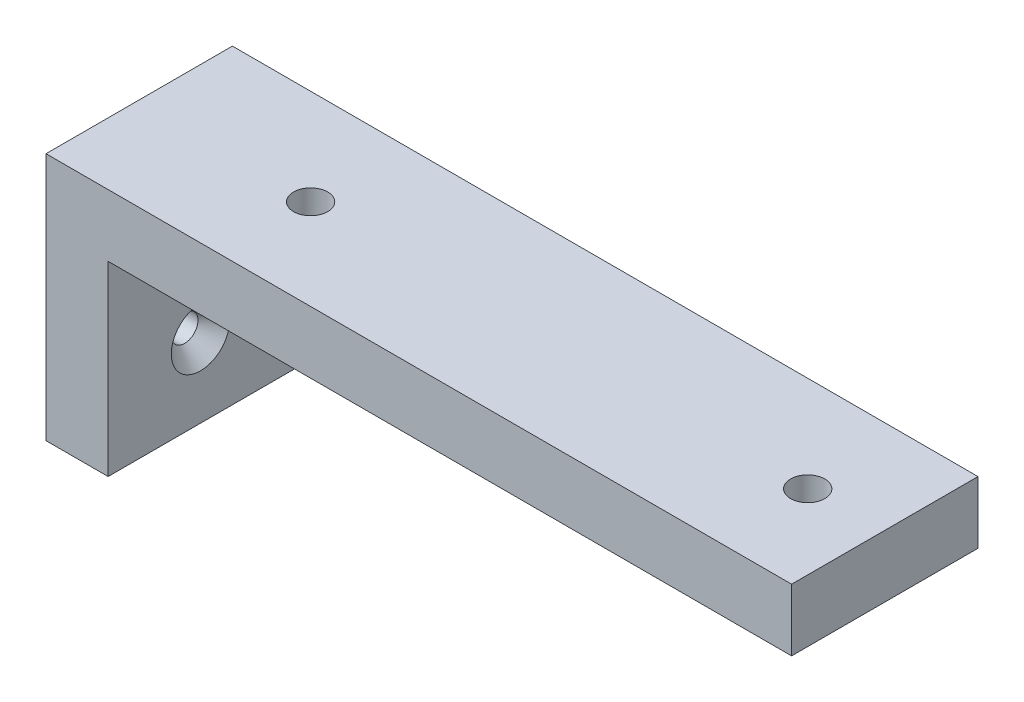
ISO-10303-21;
HEADER;
FILE_DESCRIPTION(('STEP AP214'),'2;1');
FILE_NAME('part.step','',(''),(''),'','','');
FILE_SCHEMA(('AUTOMOTIVE_DESIGN { 1 0 10303 214 1 1 1 1 }'));
ENDSEC;
DATA;
#1=APPLICATION_CONTEXT('core data for automotive mechanical design processes');
#2=APPLICATION_PROTOCOL_DEFINITION('international standard','automotive_design',2000,#1);
#3=PRODUCT_CONTEXT('',#1,'mechanical');
#4=PRODUCT('Part','Part','',(#3));
#5=PRODUCT_RELATED_PRODUCT_CATEGORY('part','',(#4));
#6=PRODUCT_DEFINITION_FORMATION('','',#4);
#7=PRODUCT_DEFINITION_CONTEXT('part definition',#1,'design');
#8=PRODUCT_DEFINITION('design','',#6,#7);
#9=PRODUCT_DEFINITION_SHAPE('','',#8);
#10=(LENGTH_UNIT() NAMED_UNIT(*) SI_UNIT(.MILLI.,.METRE.));
#11=(NAMED_UNIT(*) PLANE_ANGLE_UNIT() SI_UNIT($,.RADIAN.));
#12=(NAMED_UNIT(*) SI_UNIT($,.STERADIAN.) SOLID_ANGLE_UNIT());
#13=UNCERTAINTY_MEASURE_WITH_UNIT(LENGTH_MEASURE(1.E-05),#10,'distance_accuracy_value','');
#14=(GEOMETRIC_REPRESENTATION_CONTEXT(3) GLOBAL_UNCERTAINTY_ASSIGNED_CONTEXT((#13)) GLOBAL_UNIT_ASSIGNED_CONTEXT((#10,
#11,#12)) REPRESENTATION_CONTEXT('',''));
#15=CARTESIAN_POINT('',(0.,0.,0.));
#16=DIRECTION('',(0.,0.,1.));
#17=DIRECTION('',(1.,0.,0.));
#18=AXIS2_PLACEMENT_3D('',#15,#16,#17);
#19=CARTESIAN_POINT('',(10.,0.,30.));
#20=DIRECTION('',(0.,1.,0.));
#21=DIRECTION('',(-1.,0.,0.));
#22=AXIS2_PLACEMENT_3D('',#19,#20,#21);
#23=PLANE('',#22);
#24=DIRECTION('',(1.,0.,0.));
#25=VECTOR('',#24,1.);
#26=CARTESIAN_POINT('',(10.,0.,0.));
#27=LINE('',#26,#25);
#28=CARTESIAN_POINT('',(0.,0.,0.));
#29=VERTEX_POINT('',#28);
#30=CARTESIAN_POINT('',(10.,0.,0.));
#31=VERTEX_POINT('',#30);
#32=EDGE_CURVE('E128',#29,#31,#27,.T.);
#33=ORIENTED_EDGE('',*,*,#32,.T.);
#34=DIRECTION('',(0.,0.,-1.));
#35=VECTOR('',#34,1.);
#36=CARTESIAN_POINT('',(10.,0.,30.));
#37=LINE('',#36,#35);
#38=CARTESIAN_POINT('',(10.,0.,30.));
#39=VERTEX_POINT('',#38);
#40=EDGE_CURVE('E11',#39,#31,#37,.T.);
#41=ORIENTED_EDGE('',*,*,#40,.F.);
#42=DIRECTION('',(1.,0.,0.));
#43=VECTOR('',#42,1.);
#44=CARTESIAN_POINT('',(10.,0.,30.));
#45=LINE('',#44,#43);
#46=CARTESIAN_POINT('',(0.,0.,30.));
#47=VERTEX_POINT('',#46);
#48=EDGE_CURVE('E145',#47,#39,#45,.T.);
#49=ORIENTED_EDGE('',*,*,#48,.F.);
#50=DIRECTION('',(0.,0.,-1.));
#51=VECTOR('',#50,1.);
#52=CARTESIAN_POINT('',(0.,0.,30.));
#53=LINE('',#52,#51);
#54=EDGE_CURVE('E124',#47,#29,#53,.T.);
#55=ORIENTED_EDGE('',*,*,#54,.T.);
#56=EDGE_LOOP('',(#33,#41,#49,#55));
#57=FACE_BOUND('',#56,.T.);
#58=ADVANCED_FACE('F39',(#57),#23,.F.);
#59=CARTESIAN_POINT('',(9.99999999999999,30.,30.));
#60=DIRECTION('',(-1.,0.,0.));
#61=DIRECTION('',(0.,-1.,0.));
#62=AXIS2_PLACEMENT_3D('',#59,#60,#61);
#63=PLANE('',#62);
#64=CARTESIAN_POINT('',(10.,12.,15.1378482957966));
#65=DIRECTION('',(1.,0.,0.));
#66=DIRECTION('',(0.,0.,-1.));
#67=AXIS2_PLACEMENT_3D('',#64,#65,#66);
#68=CIRCLE('',#67,4.7);
#69=CARTESIAN_POINT('',(10.,12.,10.4378482957966));
#70=VERTEX_POINT('',#69);
#71=EDGE_CURVE('E310',#70,#70,#68,.T.);
#72=ORIENTED_EDGE('',*,*,#71,.F.);
#73=EDGE_LOOP('',(#72));
#74=FACE_BOUND('',#73,.T.);
#75=DIRECTION('',(0.,1.,0.));
#76=VECTOR('',#75,1.);
#77=CARTESIAN_POINT('',(9.99999999999999,30.,0.));
#78=LINE('',#77,#76);
#79=CARTESIAN_POINT('',(9.99999999999999,30.,0.));
#80=VERTEX_POINT('',#79);
#81=EDGE_CURVE('E132',#31,#80,#78,.T.);
#82=ORIENTED_EDGE('',*,*,#81,.T.);
#83=DIRECTION('',(0.,0.,-1.));
#84=VECTOR('',#83,1.);
#85=CARTESIAN_POINT('',(9.99999999999999,30.,30.));
#86=LINE('',#85,#84);
#87=CARTESIAN_POINT('',(9.99999999999999,30.,30.));
#88=VERTEX_POINT('',#87);
#89=EDGE_CURVE('E48',#88,#80,#86,.T.);
#90=ORIENTED_EDGE('',*,*,#89,.F.);
#91=DIRECTION('',(0.,1.,0.));
#92=VECTOR('',#91,1.);
#93=CARTESIAN_POINT('',(9.99999999999999,30.,30.));
#94=LINE('',#93,#92);
#95=EDGE_CURVE('E93',#39,#88,#94,.T.);
#96=ORIENTED_EDGE('',*,*,#95,.F.);
#97=ORIENTED_EDGE('',*,*,#40,.T.);
#98=EDGE_LOOP('',(#82,#90,#96,#97));
#99=FACE_BOUND('',#98,.T.);
#100=ADVANCED_FACE('F176',(#74,#99),#63,.F.);
#101=CARTESIAN_POINT('',(120.,30.,30.));
#102=DIRECTION('',(0.,1.,0.));
#103=DIRECTION('',(-1.,0.,0.));
#104=AXIS2_PLACEMENT_3D('',#101,#102,#103);
#105=PLANE('',#104);
#106=CARTESIAN_POINT('',(108.,30.,15.4100986799949));
#107=DIRECTION('',(0.,-1.,0.));
#108=DIRECTION('',(0.,0.,-1.));
#109=AXIS2_PLACEMENT_3D('',#106,#107,#108);
#110=CIRCLE('',#109,6.119);
#111=CARTESIAN_POINT('',(108.,30.,9.29109867999495));
#112=VERTEX_POINT('',#111);
#113=EDGE_CURVE('E319',#112,#112,#110,.T.);
#114=ORIENTED_EDGE('',*,*,#113,.F.);
#115=EDGE_LOOP('',(#114));
#116=FACE_BOUND('',#115,.T.);
#117=CARTESIAN_POINT('',(28.,30.,15.4100986799949));
#118=DIRECTION('',(0.,-1.,0.));
#119=DIRECTION('',(0.,0.,-1.));
#120=AXIS2_PLACEMENT_3D('',#117,#118,#119);
#121=CIRCLE('',#120,6.119);
#122=CARTESIAN_POINT('',(28.,30.,9.29109867999494));
#123=VERTEX_POINT('',#122);
#124=EDGE_CURVE('E335',#123,#123,#121,.T.);
#125=ORIENTED_EDGE('',*,*,#124,.F.);
#126=EDGE_LOOP('',(#125));
#127=FACE_BOUND('',#126,.T.);
#128=DIRECTION('',(1.,0.,0.));
#129=VECTOR('',#128,1.);
#130=CARTESIAN_POINT('',(120.,30.,0.));
#131=LINE('',#130,#129);
#132=CARTESIAN_POINT('',(120.,30.,0.));
#133=VERTEX_POINT('',#132);
#134=EDGE_CURVE('E136',#80,#133,#131,.T.);
#135=ORIENTED_EDGE('',*,*,#134,.T.);
#136=DIRECTION('',(0.,0.,-1.));
#137=VECTOR('',#136,1.);
#138=CARTESIAN_POINT('',(120.,30.,30.));
#139=LINE('',#138,#137);
#140=CARTESIAN_POINT('',(120.,30.,30.));
#141=VERTEX_POINT('',#140);
#142=EDGE_CURVE('E117',#141,#133,#139,.T.);
#143=ORIENTED_EDGE('',*,*,#142,.F.);
#144=DIRECTION('',(1.,0.,0.));
#145=VECTOR('',#144,1.);
#146=CARTESIAN_POINT('',(120.,30.,30.));
#147=LINE('',#146,#145);
#148=EDGE_CURVE('E106',#88,#141,#147,.T.);
#149=ORIENTED_EDGE('',*,*,#148,.F.);
#150=ORIENTED_EDGE('',*,*,#89,.T.);
#151=EDGE_LOOP('',(#135,#143,#149,#150));
#152=FACE_BOUND('',#151,.T.);
#153=ADVANCED_FACE('F155',(#116,#127,#152),#105,.F.);
#154=CARTESIAN_POINT('',(120.,40.,30.));
#155=DIRECTION('',(-1.,0.,0.));
#156=DIRECTION('',(0.,0.,1.));
#157=AXIS2_PLACEMENT_3D('',#154,#155,#156);
#158=PLANE('',#157);
#159=DIRECTION('',(0.,1.,0.));
#160=VECTOR('',#159,1.);
#161=CARTESIAN_POINT('',(120.,40.,0.));
#162=LINE('',#161,#160);
#163=CARTESIAN_POINT('',(120.,40.,0.));
#164=VERTEX_POINT('',#163);
#165=EDGE_CURVE('E115',#133,#164,#162,.T.);
#166=ORIENTED_EDGE('',*,*,#165,.T.);
#167=DIRECTION('',(0.,0.,-1.));
#168=VECTOR('',#167,1.);
#169=CARTESIAN_POINT('',(120.,40.,30.));
#170=LINE('',#169,#168);
#171=CARTESIAN_POINT('',(120.,40.,30.));
#172=VERTEX_POINT('',#171);
#173=EDGE_CURVE('E112',#172,#164,#170,.T.);
#174=ORIENTED_EDGE('',*,*,#173,.F.);
#175=DIRECTION('',(0.,1.,0.));
#176=VECTOR('',#175,1.);
#177=CARTESIAN_POINT('',(120.,40.,30.));
#178=LINE('',#177,#176);
#179=EDGE_CURVE('E100',#141,#172,#178,.T.);
#180=ORIENTED_EDGE('',*,*,#179,.F.);
#181=ORIENTED_EDGE('',*,*,#142,.T.);
#182=EDGE_LOOP('',(#166,#174,#180,#181));
#183=FACE_BOUND('',#182,.T.);
#184=ADVANCED_FACE('F113',(#183),#158,.F.);
#185=CARTESIAN_POINT('',(0.,40.,30.));
#186=DIRECTION('',(0.,-1.,0.));
#187=DIRECTION('',(0.,0.,-1.));
#188=AXIS2_PLACEMENT_3D('',#185,#186,#187);
#189=PLANE('',#188);
#190=CARTESIAN_POINT('',(108.,40.,15.4100986799949));
#191=DIRECTION('',(0.,-1.,0.));
#192=DIRECTION('',(0.,0.,-1.));
#193=AXIS2_PLACEMENT_3D('',#190,#191,#192);
#194=CIRCLE('',#193,2.75);
#195=CARTESIAN_POINT('',(108.,40.,12.6600986799949));
#196=VERTEX_POINT('',#195);
#197=EDGE_CURVE('E331',#196,#196,#194,.T.);
#198=ORIENTED_EDGE('',*,*,#197,.T.);
#199=EDGE_LOOP('',(#198));
#200=FACE_BOUND('',#199,.T.);
#201=CARTESIAN_POINT('',(28.,40.,15.4100986799949));
#202=DIRECTION('',(0.,-1.,0.));
#203=DIRECTION('',(0.,0.,-1.));
#204=AXIS2_PLACEMENT_3D('',#201,#202,#203);
#205=CIRCLE('',#204,2.75);
#206=CARTESIAN_POINT('',(28.,40.,12.6600986799949));
#207=VERTEX_POINT('',#206);
#208=EDGE_CURVE('E133',#207,#207,#205,.T.);
#209=ORIENTED_EDGE('',*,*,#208,.T.);
#210=EDGE_LOOP('',(#209));
#211=FACE_BOUND('',#210,.T.);
#212=DIRECTION('',(-1.,0.,0.));
#213=VECTOR('',#212,1.);
#214=CARTESIAN_POINT('',(0.,40.,0.));
#215=LINE('',#214,#213);
#216=CARTESIAN_POINT('',(0.,40.,0.));
#217=VERTEX_POINT('',#216);
#218=EDGE_CURVE('E79',#164,#217,#215,.T.);
#219=ORIENTED_EDGE('',*,*,#218,.T.);
#220=DIRECTION('',(0.,0.,-1.));
#221=VECTOR('',#220,1.);
#222=CARTESIAN_POINT('',(0.,40.,30.));
#223=LINE('',#222,#221);
#224=CARTESIAN_POINT('',(0.,40.,30.));
#225=VERTEX_POINT('',#224);
#226=EDGE_CURVE('E118',#225,#217,#223,.T.);
#227=ORIENTED_EDGE('',*,*,#226,.F.);
#228=DIRECTION('',(-1.,0.,0.));
#229=VECTOR('',#228,1.);
#230=CARTESIAN_POINT('',(0.,40.,30.));
#231=LINE('',#230,#229);
#232=EDGE_CURVE('E104',#172,#225,#231,.T.);
#233=ORIENTED_EDGE('',*,*,#232,.F.);
#234=ORIENTED_EDGE('',*,*,#173,.T.);
#235=EDGE_LOOP('',(#219,#227,#233,#234));
#236=FACE_BOUND('',#235,.T.);
#237=ADVANCED_FACE('F120',(#200,#211,#236),#189,.F.);
#238=CARTESIAN_POINT('',(0.,0.,30.));
#239=DIRECTION('',(1.,0.,0.));
#240=DIRECTION('',(0.,0.,-1.));
#241=AXIS2_PLACEMENT_3D('',#238,#239,#240);
#242=PLANE('',#241);
#243=CARTESIAN_POINT('',(0.,12.,15.1378482957966));
#244=DIRECTION('',(1.,0.,0.));
#245=DIRECTION('',(0.,0.,-1.));
#246=AXIS2_PLACEMENT_3D('',#243,#244,#245);
#247=CIRCLE('',#246,2.15);
#248=CARTESIAN_POINT('',(0.,12.,12.9878482957966));
#249=VERTEX_POINT('',#248);
#250=EDGE_CURVE('E314',#249,#249,#247,.T.);
#251=ORIENTED_EDGE('',*,*,#250,.T.);
#252=EDGE_LOOP('',(#251));
#253=FACE_BOUND('',#252,.T.);
#254=DIRECTION('',(0.,-1.,0.));
#255=VECTOR('',#254,1.);
#256=CARTESIAN_POINT('',(0.,0.,0.));
#257=LINE('',#256,#255);
#258=EDGE_CURVE('E85',#217,#29,#257,.T.);
#259=ORIENTED_EDGE('',*,*,#258,.T.);
#260=ORIENTED_EDGE('',*,*,#54,.F.);
#261=DIRECTION('',(0.,-1.,0.));
#262=VECTOR('',#261,1.);
#263=CARTESIAN_POINT('',(0.,0.,30.));
#264=LINE('',#263,#262);
#265=EDGE_CURVE('E56',#225,#47,#264,.T.);
#266=ORIENTED_EDGE('',*,*,#265,.F.);
#267=ORIENTED_EDGE('',*,*,#226,.T.);
#268=EDGE_LOOP('',(#259,#260,#266,#267));
#269=FACE_BOUND('',#268,.T.);
#270=ADVANCED_FACE('F162',(#253,#269),#242,.F.);
#271=CARTESIAN_POINT('',(0.,0.,30.));
#272=DIRECTION('',(0.,0.,-1.));
#273=DIRECTION('',(-1.,0.,0.));
#274=AXIS2_PLACEMENT_3D('',#271,#272,#273);
#275=PLANE('',#274);
#276=ORIENTED_EDGE('',*,*,#48,.T.);
#277=ORIENTED_EDGE('',*,*,#95,.T.);
#278=ORIENTED_EDGE('',*,*,#148,.T.);
#279=ORIENTED_EDGE('',*,*,#179,.T.);
#280=ORIENTED_EDGE('',*,*,#232,.T.);
#281=ORIENTED_EDGE('',*,*,#265,.T.);
#282=EDGE_LOOP('',(#276,#277,#278,#279,#280,#281));
#283=FACE_BOUND('',#282,.T.);
#284=ADVANCED_FACE('F102',(#283),#275,.F.);
#285=CARTESIAN_POINT('',(0.,0.,0.));
#286=DIRECTION('',(0.,0.,-1.));
#287=DIRECTION('',(-1.,0.,0.));
#288=AXIS2_PLACEMENT_3D('',#285,#286,#287);
#289=PLANE('',#288);
#290=ORIENTED_EDGE('',*,*,#32,.F.);
#291=ORIENTED_EDGE('',*,*,#258,.F.);
#292=ORIENTED_EDGE('',*,*,#218,.F.);
#293=ORIENTED_EDGE('',*,*,#165,.F.);
#294=ORIENTED_EDGE('',*,*,#134,.F.);
#295=ORIENTED_EDGE('',*,*,#81,.F.);
#296=EDGE_LOOP('',(#290,#291,#292,#293,#294,#295));
#297=FACE_BOUND('',#296,.T.);
#298=ADVANCED_FACE('F158',(#297),#289,.T.);
#299=CARTESIAN_POINT('',(28.,30.,15.4100986799949));
#300=DIRECTION('',(0.,-1.,0.));
#301=DIRECTION('',(0.,0.,-1.));
#302=AXIS2_PLACEMENT_3D('',#299,#300,#301);
#303=CYLINDRICAL_SURFACE('',#302,2.75);
#304=ORIENTED_EDGE('',*,*,#208,.F.);
#305=EDGE_LOOP('',(#304));
#306=FACE_BOUND('',#305,.T.);
#307=CARTESIAN_POINT('',(28.,33.5,15.4100986799949));
#308=DIRECTION('',(0.,-1.,0.));
#309=DIRECTION('',(0.,0.,-1.));
#310=AXIS2_PLACEMENT_3D('',#307,#308,#309);
#311=CIRCLE('',#310,2.75);
#312=CARTESIAN_POINT('',(28.,33.5,12.6600986799949));
#313=VERTEX_POINT('',#312);
#314=EDGE_CURVE('E343',#313,#313,#311,.T.);
#315=ORIENTED_EDGE('',*,*,#314,.T.);
#316=EDGE_LOOP('',(#315));
#317=FACE_BOUND('',#316,.T.);
#318=ADVANCED_FACE('F207',(#306,#317),#303,.F.);
#319=CARTESIAN_POINT('',(30.75,33.5,15.4100986799949));
#320=DIRECTION('',(0.,1.,0.));
#321=DIRECTION('',(0.,0.,1.));
#322=AXIS2_PLACEMENT_3D('',#319,#320,#321);
#323=PLANE('',#322);
#324=ORIENTED_EDGE('',*,*,#314,.F.);
#325=EDGE_LOOP('',(#324));
#326=FACE_BOUND('',#325,.T.);
#327=CARTESIAN_POINT('',(28.,33.5,15.4100986799949));
#328=DIRECTION('',(0.,-1.,0.));
#329=DIRECTION('',(0.,0.,-1.));
#330=AXIS2_PLACEMENT_3D('',#327,#328,#329);
#331=CIRCLE('',#330,6.119);
#332=CARTESIAN_POINT('',(28.,33.5,9.29109867999494));
#333=VERTEX_POINT('',#332);
#334=EDGE_CURVE('E339',#333,#333,#331,.T.);
#335=ORIENTED_EDGE('',*,*,#334,.T.);
#336=EDGE_LOOP('',(#335));
#337=FACE_BOUND('',#336,.T.);
#338=ADVANCED_FACE('F212',(#326,#337),#323,.F.);
#339=CARTESIAN_POINT('',(28.,30.,15.4100986799949));
#340=DIRECTION('',(0.,-1.,0.));
#341=DIRECTION('',(0.,0.,-1.));
#342=AXIS2_PLACEMENT_3D('',#339,#340,#341);
#343=CYLINDRICAL_SURFACE('',#342,6.119);
#344=ORIENTED_EDGE('',*,*,#334,.F.);
#345=EDGE_LOOP('',(#344));
#346=FACE_BOUND('',#345,.T.);
#347=ORIENTED_EDGE('',*,*,#124,.T.);
#348=EDGE_LOOP('',(#347));
#349=FACE_BOUND('',#348,.T.);
#350=ADVANCED_FACE('F224',(#346,#349),#343,.F.);
#351=CARTESIAN_POINT('',(108.,30.,15.4100986799949));
#352=DIRECTION('',(0.,-1.,0.));
#353=DIRECTION('',(0.,0.,-1.));
#354=AXIS2_PLACEMENT_3D('',#351,#352,#353);
#355=CYLINDRICAL_SURFACE('',#354,2.75);
#356=ORIENTED_EDGE('',*,*,#197,.F.);
#357=EDGE_LOOP('',(#356));
#358=FACE_BOUND('',#357,.T.);
#359=CARTESIAN_POINT('',(108.,33.5,15.4100986799949));
#360=DIRECTION('',(0.,-1.,0.));
#361=DIRECTION('',(0.,0.,-1.));
#362=AXIS2_PLACEMENT_3D('',#359,#360,#361);
#363=CIRCLE('',#362,2.75);
#364=CARTESIAN_POINT('',(108.,33.5,12.6600986799949));
#365=VERTEX_POINT('',#364);
#366=EDGE_CURVE('E327',#365,#365,#363,.T.);
#367=ORIENTED_EDGE('',*,*,#366,.T.);
#368=EDGE_LOOP('',(#367));
#369=FACE_BOUND('',#368,.T.);
#370=ADVANCED_FACE('F234',(#358,#369),#355,.F.);
#371=CARTESIAN_POINT('',(110.75,33.5,15.4100986799949));
#372=DIRECTION('',(0.,1.,0.));
#373=DIRECTION('',(0.,0.,1.));
#374=AXIS2_PLACEMENT_3D('',#371,#372,#373);
#375=PLANE('',#374);
#376=ORIENTED_EDGE('',*,*,#366,.F.);
#377=EDGE_LOOP('',(#376));
#378=FACE_BOUND('',#377,.T.);
#379=CARTESIAN_POINT('',(108.,33.5,15.4100986799949));
#380=DIRECTION('',(0.,-1.,0.));
#381=DIRECTION('',(0.,0.,-1.));
#382=AXIS2_PLACEMENT_3D('',#379,#380,#381);
#383=CIRCLE('',#382,6.119);
#384=CARTESIAN_POINT('',(108.,33.5,9.29109867999495));
#385=VERTEX_POINT('',#384);
#386=EDGE_CURVE('E323',#385,#385,#383,.T.);
#387=ORIENTED_EDGE('',*,*,#386,.T.);
#388=EDGE_LOOP('',(#387));
#389=FACE_BOUND('',#388,.T.);
#390=ADVANCED_FACE('F244',(#378,#389),#375,.F.);
#391=CARTESIAN_POINT('',(108.,30.,15.4100986799949));
#392=DIRECTION('',(0.,-1.,0.));
#393=DIRECTION('',(0.,0.,-1.));
#394=AXIS2_PLACEMENT_3D('',#391,#392,#393);
#395=CYLINDRICAL_SURFACE('',#394,6.119);
#396=ORIENTED_EDGE('',*,*,#386,.F.);
#397=EDGE_LOOP('',(#396));
#398=FACE_BOUND('',#397,.T.);
#399=ORIENTED_EDGE('',*,*,#113,.T.);
#400=EDGE_LOOP('',(#399));
#401=FACE_BOUND('',#400,.T.);
#402=ADVANCED_FACE('F254',(#398,#401),#395,.F.);
#403=CARTESIAN_POINT('',(10.,12.,15.1378482957966));
#404=DIRECTION('',(1.,0.,0.));
#405=DIRECTION('',(0.,0.,-1.));
#406=AXIS2_PLACEMENT_3D('',#403,#404,#405);
#407=CYLINDRICAL_SURFACE('',#406,2.15);
#408=ORIENTED_EDGE('',*,*,#250,.F.);
#409=EDGE_LOOP('',(#408));
#410=FACE_BOUND('',#409,.T.);
#411=CARTESIAN_POINT('',(7.45,12.,15.1378482957966));
#412=DIRECTION('',(1.,0.,0.));
#413=DIRECTION('',(0.,0.,-1.));
#414=AXIS2_PLACEMENT_3D('',#411,#412,#413);
#415=CIRCLE('',#414,2.15);
#416=CARTESIAN_POINT('',(7.45,12.,12.9878482957966));
#417=VERTEX_POINT('',#416);
#418=EDGE_CURVE('E308',#417,#417,#415,.T.);
#419=ORIENTED_EDGE('',*,*,#418,.T.);
#420=EDGE_LOOP('',(#419));
#421=FACE_BOUND('',#420,.T.);
#422=ADVANCED_FACE('F263',(#410,#421),#407,.F.);
#423=CARTESIAN_POINT('',(10.,12.,15.1378482957966));
#424=DIRECTION('',(1.,0.,0.));
#425=DIRECTION('',(0.,0.,-1.));
#426=AXIS2_PLACEMENT_3D('',#423,#424,#425);
#427=CONICAL_SURFACE('',#426,4.7,0.785398163397449);
#428=ORIENTED_EDGE('',*,*,#418,.F.);
#429=EDGE_LOOP('',(#428));
#430=FACE_BOUND('',#429,.T.);
#431=ORIENTED_EDGE('',*,*,#71,.T.);
#432=EDGE_LOOP('',(#431));
#433=FACE_BOUND('',#432,.T.);
#434=ADVANCED_FACE('F283',(#430,#433),#427,.F.);
#435=CLOSED_SHELL('',(#58,#100,#153,#184,#237,#270,#284,#298,#318,#338,#350,#370,#390,#402,#422,#434));
#436=MANIFOLD_SOLID_BREP('B2',#435);
#437=ADVANCED_BREP_SHAPE_REPRESENTATION('',(#18,#436),#14);
#438=SHAPE_DEFINITION_REPRESENTATION(#9,#437);
ENDSEC;
END-ISO-10303-21;
